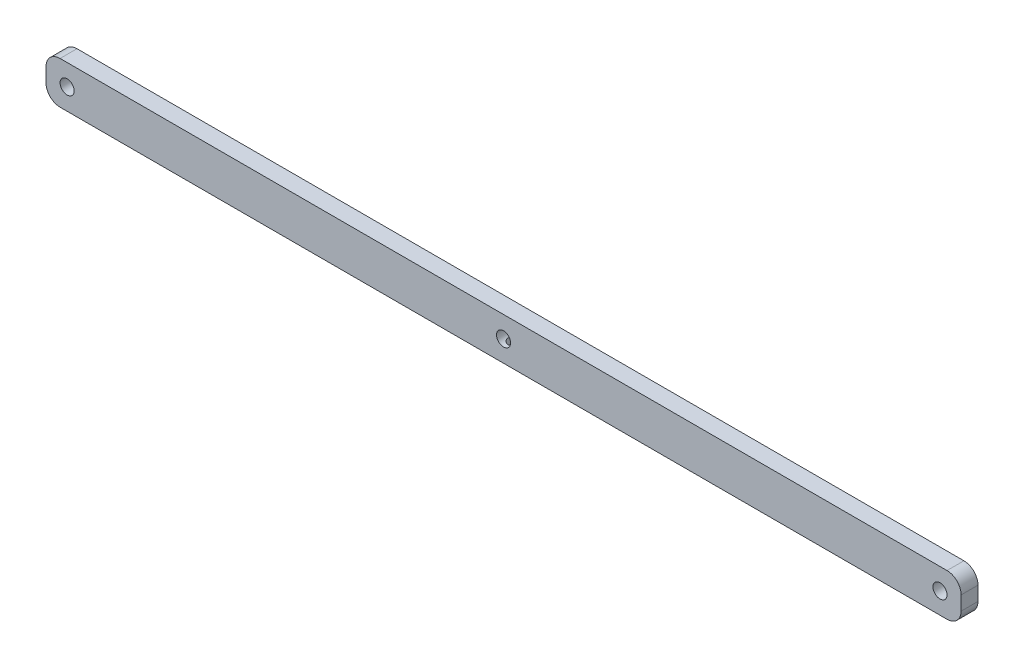
ISO-10303-21;
HEADER;
FILE_DESCRIPTION(('STEP AP214'),'2;1');
FILE_NAME('part.step','',(''),(''),'','','');
FILE_SCHEMA(('AUTOMOTIVE_DESIGN { 1 0 10303 214 1 1 1 1 }'));
ENDSEC;
DATA;
#1=APPLICATION_CONTEXT('core data for automotive mechanical design processes');
#2=APPLICATION_PROTOCOL_DEFINITION('international standard','automotive_design',2000,#1);
#3=PRODUCT_CONTEXT('',#1,'mechanical');
#4=PRODUCT('Part','Part','',(#3));
#5=PRODUCT_RELATED_PRODUCT_CATEGORY('part','',(#4));
#6=PRODUCT_DEFINITION_FORMATION('','',#4);
#7=PRODUCT_DEFINITION_CONTEXT('part definition',#1,'design');
#8=PRODUCT_DEFINITION('design','',#6,#7);
#9=PRODUCT_DEFINITION_SHAPE('','',#8);
#10=(LENGTH_UNIT() NAMED_UNIT(*) SI_UNIT(.MILLI.,.METRE.));
#11=(NAMED_UNIT(*) PLANE_ANGLE_UNIT() SI_UNIT($,.RADIAN.));
#12=(NAMED_UNIT(*) SI_UNIT($,.STERADIAN.) SOLID_ANGLE_UNIT());
#13=UNCERTAINTY_MEASURE_WITH_UNIT(LENGTH_MEASURE(1.E-05),#10,'distance_accuracy_value','');
#14=(GEOMETRIC_REPRESENTATION_CONTEXT(3) GLOBAL_UNCERTAINTY_ASSIGNED_CONTEXT((#13)) GLOBAL_UNIT_ASSIGNED_CONTEXT((#10,
#11,#12)) REPRESENTATION_CONTEXT('',''));
#15=CARTESIAN_POINT('',(0.,0.,0.));
#16=DIRECTION('',(0.,0.,1.));
#17=DIRECTION('',(1.,0.,0.));
#18=AXIS2_PLACEMENT_3D('',#15,#16,#17);
#19=CARTESIAN_POINT('',(0.,0.,3.));
#20=DIRECTION('',(0.,0.,-1.));
#21=DIRECTION('',(-1.,0.,0.));
#22=AXIS2_PLACEMENT_3D('',#19,#20,#21);
#23=PLANE('',#22);
#24=DIRECTION('',(0.,-1.,0.));
#25=VECTOR('',#24,1.);
#26=CARTESIAN_POINT('',(-162.5,-7.5,3.));
#27=LINE('',#26,#25);
#28=CARTESIAN_POINT('',(-162.5,2.5,3.));
#29=VERTEX_POINT('',#28);
#30=CARTESIAN_POINT('',(-162.5,-2.5,3.));
#31=VERTEX_POINT('',#30);
#32=EDGE_CURVE('E169',#29,#31,#27,.T.);
#33=ORIENTED_EDGE('',*,*,#32,.T.);
#34=CARTESIAN_POINT('',(-157.5,-2.5,3.));
#35=DIRECTION('',(0.,0.,-1.));
#36=DIRECTION('',(-1.,0.,0.));
#37=AXIS2_PLACEMENT_3D('',#34,#35,#36);
#38=CIRCLE('',#37,5.);
#39=CARTESIAN_POINT('',(-157.5,-7.5,3.));
#40=VERTEX_POINT('',#39);
#41=EDGE_CURVE('E147',#31,#40,#38,.F.);
#42=ORIENTED_EDGE('',*,*,#41,.T.);
#43=DIRECTION('',(1.,0.,0.));
#44=VECTOR('',#43,1.);
#45=CARTESIAN_POINT('',(162.5,-7.5,3.));
#46=LINE('',#45,#44);
#47=CARTESIAN_POINT('',(157.5,-7.5,3.));
#48=VERTEX_POINT('',#47);
#49=EDGE_CURVE('E117',#40,#48,#46,.T.);
#50=ORIENTED_EDGE('',*,*,#49,.T.);
#51=CARTESIAN_POINT('',(157.5,-2.5,3.));
#52=DIRECTION('',(0.,0.,-1.));
#53=DIRECTION('',(-1.,0.,0.));
#54=AXIS2_PLACEMENT_3D('',#51,#52,#53);
#55=CIRCLE('',#54,5.);
#56=CARTESIAN_POINT('',(162.5,-2.5,3.));
#57=VERTEX_POINT('',#56);
#58=EDGE_CURVE('E53',#48,#57,#55,.F.);
#59=ORIENTED_EDGE('',*,*,#58,.T.);
#60=DIRECTION('',(0.,1.,0.));
#61=VECTOR('',#60,1.);
#62=CARTESIAN_POINT('',(162.5,7.5,3.));
#63=LINE('',#62,#61);
#64=CARTESIAN_POINT('',(162.5,2.5,3.));
#65=VERTEX_POINT('',#64);
#66=EDGE_CURVE('E133',#57,#65,#63,.T.);
#67=ORIENTED_EDGE('',*,*,#66,.T.);
#68=CARTESIAN_POINT('',(157.5,2.5,3.));
#69=DIRECTION('',(0.,0.,-1.));
#70=DIRECTION('',(-1.,0.,0.));
#71=AXIS2_PLACEMENT_3D('',#68,#69,#70);
#72=CIRCLE('',#71,5.);
#73=CARTESIAN_POINT('',(157.5,7.5,3.));
#74=VERTEX_POINT('',#73);
#75=EDGE_CURVE('E143',#65,#74,#72,.F.);
#76=ORIENTED_EDGE('',*,*,#75,.T.);
#77=DIRECTION('',(-1.,0.,0.));
#78=VECTOR('',#77,1.);
#79=CARTESIAN_POINT('',(-162.5,7.5,3.));
#80=LINE('',#79,#78);
#81=CARTESIAN_POINT('',(-157.5,7.5,3.));
#82=VERTEX_POINT('',#81);
#83=EDGE_CURVE('E127',#74,#82,#80,.T.);
#84=ORIENTED_EDGE('',*,*,#83,.T.);
#85=CARTESIAN_POINT('',(-157.5,2.5,3.));
#86=DIRECTION('',(0.,0.,-1.));
#87=DIRECTION('',(-1.,0.,0.));
#88=AXIS2_PLACEMENT_3D('',#85,#86,#87);
#89=CIRCLE('',#88,5.);
#90=EDGE_CURVE('E145',#82,#29,#89,.F.);
#91=ORIENTED_EDGE('',*,*,#90,.T.);
#92=EDGE_LOOP('',(#33,#42,#50,#59,#67,#76,#84,#91));
#93=FACE_BOUND('',#92,.T.);
#94=CARTESIAN_POINT('',(155.,0.,3.));
#95=DIRECTION('',(0.,0.,1.));
#96=DIRECTION('',(1.,0.,0.));
#97=AXIS2_PLACEMENT_3D('',#94,#95,#96);
#98=CIRCLE('',#97,2.5);
#99=CARTESIAN_POINT('',(157.5,0.,3.));
#100=VERTEX_POINT('',#99);
#101=EDGE_CURVE('E178',#100,#100,#98,.T.);
#102=ORIENTED_EDGE('',*,*,#101,.F.);
#103=EDGE_LOOP('',(#102));
#104=FACE_BOUND('',#103,.T.);
#105=CARTESIAN_POINT('',(-155.,0.,3.));
#106=DIRECTION('',(0.,0.,1.));
#107=DIRECTION('',(1.,0.,0.));
#108=AXIS2_PLACEMENT_3D('',#105,#106,#107);
#109=CIRCLE('',#108,2.5);
#110=CARTESIAN_POINT('',(-152.5,0.,3.));
#111=VERTEX_POINT('',#110);
#112=EDGE_CURVE('E183',#111,#111,#109,.T.);
#113=ORIENTED_EDGE('',*,*,#112,.F.);
#114=EDGE_LOOP('',(#113));
#115=FACE_BOUND('',#114,.T.);
#116=CARTESIAN_POINT('',(0.,0.,3.));
#117=DIRECTION('',(0.,0.,1.));
#118=DIRECTION('',(1.,0.,0.));
#119=AXIS2_PLACEMENT_3D('',#116,#117,#118);
#120=CIRCLE('',#119,2.5);
#121=CARTESIAN_POINT('',(2.5,0.,3.));
#122=VERTEX_POINT('',#121);
#123=EDGE_CURVE('E188',#122,#122,#120,.T.);
#124=ORIENTED_EDGE('',*,*,#123,.F.);
#125=EDGE_LOOP('',(#124));
#126=FACE_BOUND('',#125,.T.);
#127=ADVANCED_FACE('F33',(#93,#104,#115,#126),#23,.F.);
#128=CARTESIAN_POINT('',(0.,0.,-3.));
#129=DIRECTION('',(0.,0.,-1.));
#130=DIRECTION('',(-1.,0.,0.));
#131=AXIS2_PLACEMENT_3D('',#128,#129,#130);
#132=PLANE('',#131);
#133=CARTESIAN_POINT('',(-155.,0.,-3.));
#134=DIRECTION('',(0.,0.,1.));
#135=DIRECTION('',(1.,0.,0.));
#136=AXIS2_PLACEMENT_3D('',#133,#134,#135);
#137=CIRCLE('',#136,2.5);
#138=CARTESIAN_POINT('',(-152.5,0.,-3.));
#139=VERTEX_POINT('',#138);
#140=EDGE_CURVE('E185',#139,#139,#137,.T.);
#141=ORIENTED_EDGE('',*,*,#140,.T.);
#142=EDGE_LOOP('',(#141));
#143=FACE_BOUND('',#142,.T.);
#144=DIRECTION('',(1.,0.,0.));
#145=VECTOR('',#144,1.);
#146=CARTESIAN_POINT('',(162.5,-7.5,-3.));
#147=LINE('',#146,#145);
#148=CARTESIAN_POINT('',(-157.5,-7.5,-3.));
#149=VERTEX_POINT('',#148);
#150=CARTESIAN_POINT('',(157.5,-7.5,-3.));
#151=VERTEX_POINT('',#150);
#152=EDGE_CURVE('E115',#149,#151,#147,.T.);
#153=ORIENTED_EDGE('',*,*,#152,.F.);
#154=CARTESIAN_POINT('',(-157.5,-2.5,-3.));
#155=DIRECTION('',(0.,0.,-1.));
#156=DIRECTION('',(-1.,0.,0.));
#157=AXIS2_PLACEMENT_3D('',#154,#155,#156);
#158=CIRCLE('',#157,5.);
#159=CARTESIAN_POINT('',(-162.5,-2.5,-3.));
#160=VERTEX_POINT('',#159);
#161=EDGE_CURVE('E98',#149,#160,#158,.T.);
#162=ORIENTED_EDGE('',*,*,#161,.T.);
#163=DIRECTION('',(0.,-1.,0.));
#164=VECTOR('',#163,1.);
#165=CARTESIAN_POINT('',(-162.5,-7.5,-3.));
#166=LINE('',#165,#164);
#167=CARTESIAN_POINT('',(-162.5,2.5,-3.));
#168=VERTEX_POINT('',#167);
#169=EDGE_CURVE('E125',#168,#160,#166,.T.);
#170=ORIENTED_EDGE('',*,*,#169,.F.);
#171=CARTESIAN_POINT('',(-157.5,2.5,-3.));
#172=DIRECTION('',(0.,0.,-1.));
#173=DIRECTION('',(-1.,0.,0.));
#174=AXIS2_PLACEMENT_3D('',#171,#172,#173);
#175=CIRCLE('',#174,5.);
#176=CARTESIAN_POINT('',(-157.5,7.5,-3.));
#177=VERTEX_POINT('',#176);
#178=EDGE_CURVE('E109',#168,#177,#175,.T.);
#179=ORIENTED_EDGE('',*,*,#178,.T.);
#180=DIRECTION('',(-1.,0.,0.));
#181=VECTOR('',#180,1.);
#182=CARTESIAN_POINT('',(-162.5,7.5,-3.));
#183=LINE('',#182,#181);
#184=CARTESIAN_POINT('',(157.5,7.5,-3.));
#185=VERTEX_POINT('',#184);
#186=EDGE_CURVE('E129',#185,#177,#183,.T.);
#187=ORIENTED_EDGE('',*,*,#186,.F.);
#188=CARTESIAN_POINT('',(157.5,2.5,-3.));
#189=DIRECTION('',(0.,0.,-1.));
#190=DIRECTION('',(-1.,0.,0.));
#191=AXIS2_PLACEMENT_3D('',#188,#189,#190);
#192=CIRCLE('',#191,5.);
#193=CARTESIAN_POINT('',(162.5,2.5,-3.));
#194=VERTEX_POINT('',#193);
#195=EDGE_CURVE('E136',#185,#194,#192,.T.);
#196=ORIENTED_EDGE('',*,*,#195,.T.);
#197=DIRECTION('',(0.,1.,0.));
#198=VECTOR('',#197,1.);
#199=CARTESIAN_POINT('',(162.5,7.5,-3.));
#200=LINE('',#199,#198);
#201=CARTESIAN_POINT('',(162.5,-2.5,-3.));
#202=VERTEX_POINT('',#201);
#203=EDGE_CURVE('E124',#202,#194,#200,.T.);
#204=ORIENTED_EDGE('',*,*,#203,.F.);
#205=CARTESIAN_POINT('',(157.5,-2.5,-3.));
#206=DIRECTION('',(0.,0.,-1.));
#207=DIRECTION('',(-1.,0.,0.));
#208=AXIS2_PLACEMENT_3D('',#205,#206,#207);
#209=CIRCLE('',#208,5.);
#210=EDGE_CURVE('E118',#202,#151,#209,.T.);
#211=ORIENTED_EDGE('',*,*,#210,.T.);
#212=EDGE_LOOP('',(#153,#162,#170,#179,#187,#196,#204,#211));
#213=FACE_BOUND('',#212,.T.);
#214=CARTESIAN_POINT('',(155.,0.,-3.));
#215=DIRECTION('',(0.,0.,1.));
#216=DIRECTION('',(1.,0.,0.));
#217=AXIS2_PLACEMENT_3D('',#214,#215,#216);
#218=CIRCLE('',#217,2.5);
#219=CARTESIAN_POINT('',(157.5,0.,-3.));
#220=VERTEX_POINT('',#219);
#221=EDGE_CURVE('E174',#220,#220,#218,.T.);
#222=ORIENTED_EDGE('',*,*,#221,.T.);
#223=EDGE_LOOP('',(#222));
#224=FACE_BOUND('',#223,.T.);
#225=CARTESIAN_POINT('',(0.,0.,-3.));
#226=DIRECTION('',(0.,0.,1.));
#227=DIRECTION('',(1.,0.,0.));
#228=AXIS2_PLACEMENT_3D('',#225,#226,#227);
#229=CIRCLE('',#228,2.5);
#230=CARTESIAN_POINT('',(2.5,0.,-3.));
#231=VERTEX_POINT('',#230);
#232=EDGE_CURVE('E191',#231,#231,#229,.T.);
#233=ORIENTED_EDGE('',*,*,#232,.T.);
#234=EDGE_LOOP('',(#233));
#235=FACE_BOUND('',#234,.T.);
#236=ADVANCED_FACE('F121',(#143,#213,#224,#235),#132,.T.);
#237=CARTESIAN_POINT('',(-162.5,7.5,3.));
#238=DIRECTION('',(0.,-1.,0.));
#239=DIRECTION('',(0.,0.,-1.));
#240=AXIS2_PLACEMENT_3D('',#237,#238,#239);
#241=PLANE('',#240);
#242=ORIENTED_EDGE('',*,*,#186,.T.);
#243=DIRECTION('',(0.,0.,-1.));
#244=VECTOR('',#243,1.);
#245=CARTESIAN_POINT('',(-157.5,7.5,3.));
#246=LINE('',#245,#244);
#247=EDGE_CURVE('E152',#177,#82,#246,.F.);
#248=ORIENTED_EDGE('',*,*,#247,.T.);
#249=ORIENTED_EDGE('',*,*,#83,.F.);
#250=DIRECTION('',(0.,0.,-1.));
#251=VECTOR('',#250,1.);
#252=CARTESIAN_POINT('',(157.5,7.5,3.));
#253=LINE('',#252,#251);
#254=EDGE_CURVE('E149',#74,#185,#253,.T.);
#255=ORIENTED_EDGE('',*,*,#254,.T.);
#256=EDGE_LOOP('',(#242,#248,#249,#255));
#257=FACE_BOUND('',#256,.T.);
#258=ADVANCED_FACE('F165',(#257),#241,.F.);
#259=CARTESIAN_POINT('',(-162.5,-7.5,3.));
#260=DIRECTION('',(1.,0.,0.));
#261=DIRECTION('',(0.,0.,-1.));
#262=AXIS2_PLACEMENT_3D('',#259,#260,#261);
#263=PLANE('',#262);
#264=ORIENTED_EDGE('',*,*,#169,.T.);
#265=DIRECTION('',(0.,0.,-1.));
#266=VECTOR('',#265,1.);
#267=CARTESIAN_POINT('',(-162.5,-2.5,3.));
#268=LINE('',#267,#266);
#269=EDGE_CURVE('E103',#160,#31,#268,.F.);
#270=ORIENTED_EDGE('',*,*,#269,.T.);
#271=ORIENTED_EDGE('',*,*,#32,.F.);
#272=DIRECTION('',(0.,0.,-1.));
#273=VECTOR('',#272,1.);
#274=CARTESIAN_POINT('',(-162.5,2.5,3.));
#275=LINE('',#274,#273);
#276=EDGE_CURVE('E108',#29,#168,#275,.T.);
#277=ORIENTED_EDGE('',*,*,#276,.T.);
#278=EDGE_LOOP('',(#264,#270,#271,#277));
#279=FACE_BOUND('',#278,.T.);
#280=ADVANCED_FACE('F232',(#279),#263,.F.);
#281=CARTESIAN_POINT('',(162.5,-7.5,3.));
#282=DIRECTION('',(0.,1.,0.));
#283=DIRECTION('',(0.,0.,1.));
#284=AXIS2_PLACEMENT_3D('',#281,#282,#283);
#285=PLANE('',#284);
#286=CARTESIAN_POINT('',(0.,-7.5,0.));
#287=DIRECTION('',(0.,-1.,0.));
#288=DIRECTION('',(0.,0.,-1.));
#289=AXIS2_PLACEMENT_3D('',#286,#287,#288);
#290=CIRCLE('',#289,1.5);
#291=CARTESIAN_POINT('',(0.,-7.5,-1.5));
#292=VERTEX_POINT('',#291);
#293=EDGE_CURVE('E204',#292,#292,#290,.T.);
#294=ORIENTED_EDGE('',*,*,#293,.F.);
#295=EDGE_LOOP('',(#294));
#296=FACE_BOUND('',#295,.T.);
#297=ORIENTED_EDGE('',*,*,#49,.F.);
#298=DIRECTION('',(0.,0.,-1.));
#299=VECTOR('',#298,1.);
#300=CARTESIAN_POINT('',(-157.5,-7.5,3.));
#301=LINE('',#300,#299);
#302=EDGE_CURVE('E102',#40,#149,#301,.T.);
#303=ORIENTED_EDGE('',*,*,#302,.T.);
#304=ORIENTED_EDGE('',*,*,#152,.T.);
#305=DIRECTION('',(0.,0.,-1.));
#306=VECTOR('',#305,1.);
#307=CARTESIAN_POINT('',(157.5,-7.5,3.));
#308=LINE('',#307,#306);
#309=EDGE_CURVE('E119',#151,#48,#308,.F.);
#310=ORIENTED_EDGE('',*,*,#309,.T.);
#311=EDGE_LOOP('',(#297,#303,#304,#310));
#312=FACE_BOUND('',#311,.T.);
#313=ADVANCED_FACE('F114',(#296,#312),#285,.F.);
#314=CARTESIAN_POINT('',(162.5,7.5,3.));
#315=DIRECTION('',(-1.,0.,0.));
#316=DIRECTION('',(0.,0.,1.));
#317=AXIS2_PLACEMENT_3D('',#314,#315,#316);
#318=PLANE('',#317);
#319=ORIENTED_EDGE('',*,*,#203,.T.);
#320=DIRECTION('',(0.,0.,-1.));
#321=VECTOR('',#320,1.);
#322=CARTESIAN_POINT('',(162.5,2.5,3.));
#323=LINE('',#322,#321);
#324=EDGE_CURVE('E11',#194,#65,#323,.F.);
#325=ORIENTED_EDGE('',*,*,#324,.T.);
#326=ORIENTED_EDGE('',*,*,#66,.F.);
#327=DIRECTION('',(0.,0.,-1.));
#328=VECTOR('',#327,1.);
#329=CARTESIAN_POINT('',(162.5,-2.5,3.));
#330=LINE('',#329,#328);
#331=EDGE_CURVE('E41',#57,#202,#330,.T.);
#332=ORIENTED_EDGE('',*,*,#331,.T.);
#333=EDGE_LOOP('',(#319,#325,#326,#332));
#334=FACE_BOUND('',#333,.T.);
#335=ADVANCED_FACE('F155',(#334),#318,.F.);
#336=CARTESIAN_POINT('',(155.,0.,3.));
#337=DIRECTION('',(0.,0.,-1.));
#338=DIRECTION('',(-1.,0.,0.));
#339=AXIS2_PLACEMENT_3D('',#336,#337,#338);
#340=CYLINDRICAL_SURFACE('',#339,2.5);
#341=ORIENTED_EDGE('',*,*,#101,.T.);
#342=EDGE_LOOP('',(#341));
#343=FACE_BOUND('',#342,.T.);
#344=ORIENTED_EDGE('',*,*,#221,.F.);
#345=EDGE_LOOP('',(#344));
#346=FACE_BOUND('',#345,.T.);
#347=ADVANCED_FACE('F225',(#343,#346),#340,.F.);
#348=CARTESIAN_POINT('',(-155.,0.,3.));
#349=DIRECTION('',(0.,0.,-1.));
#350=DIRECTION('',(-1.,0.,0.));
#351=AXIS2_PLACEMENT_3D('',#348,#349,#350);
#352=CYLINDRICAL_SURFACE('',#351,2.5);
#353=ORIENTED_EDGE('',*,*,#112,.T.);
#354=EDGE_LOOP('',(#353));
#355=FACE_BOUND('',#354,.T.);
#356=ORIENTED_EDGE('',*,*,#140,.F.);
#357=EDGE_LOOP('',(#356));
#358=FACE_BOUND('',#357,.T.);
#359=ADVANCED_FACE('F271',(#355,#358),#352,.F.);
#360=CARTESIAN_POINT('',(0.,0.,3.));
#361=DIRECTION('',(0.,0.,-1.));
#362=DIRECTION('',(-1.,0.,0.));
#363=AXIS2_PLACEMENT_3D('',#360,#361,#362);
#364=CYLINDRICAL_SURFACE('',#363,2.5);
#365=CARTESIAN_POINT('',(0.,-2.5,-1.5));
#366=CARTESIAN_POINT('',(-0.0767298334620157,-2.49999625789732,-1.49999590899012));
#367=CARTESIAN_POINT('',(-0.153582320644178,-2.4964290461501,-1.49407132907373));
#368=CARTESIAN_POINT('',(-0.304975509530678,-2.48249903608567,-1.47067568048467));
#369=CARTESIAN_POINT('',(-0.379510034596046,-2.47211948032718,-1.45317613814577));
#370=CARTESIAN_POINT('',(-0.523751827790836,-2.44561558054488,-1.40761363883314));
#371=CARTESIAN_POINT('',(-0.593481028226564,-2.42951973272944,-1.37960304183684));
#372=CARTESIAN_POINT('',(-0.727030318214657,-2.39295367626407,-1.31413966685897));
#373=CARTESIAN_POINT('',(-0.790851869416381,-2.37248455380255,-1.27668923303125));
#374=CARTESIAN_POINT('',(-0.916299278999313,-2.32705360719088,-1.19022517329141));
#375=CARTESIAN_POINT('',(-0.977384020081413,-2.30186792195985,-1.14054630464861));
#376=CARTESIAN_POINT('',(-1.09088270411891,-2.25030439279634,-1.03253279617173));
#377=CARTESIAN_POINT('',(-1.14328534948112,-2.22392505153571,-0.974187062812681));
#378=CARTESIAN_POINT('',(-1.24444996762974,-2.1691106699591,-0.842076489503266));
#379=CARTESIAN_POINT('',(-1.29197766378809,-2.14082017703649,-0.76729822901871));
#380=CARTESIAN_POINT('',(-1.37361437764896,-2.08938301412124,-0.609153426756885));
#381=CARTESIAN_POINT('',(-1.40774517335159,-2.06622802273938,-0.525801103752431));
#382=CARTESIAN_POINT('',(-1.45440601714221,-2.0335462966093,-0.373403549346758));
#383=CARTESIAN_POINT('',(-1.47016197246826,-2.02207883137591,-0.305764001389682));
#384=CARTESIAN_POINT('',(-1.49216172340475,-2.00590308295503,-0.168196284169635));
#385=CARTESIAN_POINT('',(-1.49841734556835,-2.0011863964376,-0.0982710712455055));
#386=CARTESIAN_POINT('',(-1.50105508796008,-1.99920922463856,0.0420114942173357));
#387=CARTESIAN_POINT('',(-1.49741783408418,-2.00196337012718,0.112369425093197));
#388=CARTESIAN_POINT('',(-1.48046060478827,-2.01453261443741,0.251278775427587));
#389=CARTESIAN_POINT('',(-1.46713334620103,-2.02435302432226,0.319828795847444));
#390=CARTESIAN_POINT('',(-1.43173921881792,-2.04953186944258,0.452530242128105));
#391=CARTESIAN_POINT('',(-1.40978748666087,-2.06481711652537,0.516727053924482));
#392=CARTESIAN_POINT('',(-1.35795061770836,-2.09927051350828,0.640694990928123));
#393=CARTESIAN_POINT('',(-1.32806257259704,-2.11844008623465,0.700464483423925));
#394=CARTESIAN_POINT('',(-1.25517983184582,-2.16255327268985,0.824984097122802));
#395=CARTESIAN_POINT('',(-1.21080724397723,-2.18792043372992,0.888778092954926));
#396=CARTESIAN_POINT('',(-1.11291092784003,-2.23930599764381,1.00867648366701));
#397=CARTESIAN_POINT('',(-1.05937845100578,-2.26532500262149,1.0647734339765));
#398=CARTESIAN_POINT('',(-0.935811834382963,-2.31935504958317,1.17561298182176));
#399=CARTESIAN_POINT('',(-0.864517682704954,-2.34713836268532,1.22907730601599));
#400=CARTESIAN_POINT('',(-0.712276050458997,-2.3977242843398,1.32312204719791));
#401=CARTESIAN_POINT('',(-0.631333763943561,-2.42052955425515,1.36370935378995));
#402=CARTESIAN_POINT('',(-0.467197585268203,-2.45730392066151,1.4279321827959));
#403=CARTESIAN_POINT('',(-0.384467624173577,-2.47173957439703,1.45247535571591));
#404=CARTESIAN_POINT('',(-0.215047895144637,-2.4921884281355,1.48701119740538));
#405=CARTESIAN_POINT('',(-0.128363005661317,-2.49821172952737,1.49702131775357));
#406=CARTESIAN_POINT('',(0.0337146143773977,-2.5009057037461,1.50150784767831));
#407=CARTESIAN_POINT('',(0.109042473418719,-2.49873521714286,1.49790885508517));
#408=CARTESIAN_POINT('',(0.257829401986061,-2.48778712087048,1.47957414692807));
#409=CARTESIAN_POINT('',(0.331288509376106,-2.47900964518037,1.46483865719418));
#410=CARTESIAN_POINT('',(0.472574932157613,-2.4559479244219,1.42545656718753));
#411=CARTESIAN_POINT('',(0.540495750928483,-2.44180275662555,1.40105965092653));
#412=CARTESIAN_POINT('',(0.671265749087262,-2.40913880862844,1.34332262363473));
#413=CARTESIAN_POINT('',(0.734113924963908,-2.39061916586511,1.30998074865333));
#414=CARTESIAN_POINT('',(0.860006262823863,-2.3484549623736,1.23144302079129));
#415=CARTESIAN_POINT('',(0.922394150456836,-2.3244780273988,1.1853761709216));
#416=CARTESIAN_POINT('',(1.03902603131014,-2.27474265574731,1.08460860651138));
#417=CARTESIAN_POINT('',(1.09326040273738,-2.2489821658636,1.02989784514746));
#418=CARTESIAN_POINT('',(1.19931996735579,-2.19445423909891,0.905089609962844));
#419=CARTESIAN_POINT('',(1.24991019630915,-2.16573241746291,0.833916114534493));
#420=CARTESIAN_POINT('',(1.33845238915667,-2.1121618206671,0.682783975431793));
#421=CARTESIAN_POINT('',(1.37641766769781,-2.0873089799769,0.602834706107212));
#422=CARTESIAN_POINT('',(1.43142578795776,-2.04984909240519,0.453756977693308));
#423=CARTESIAN_POINT('',(1.4512162533619,-2.03575659328729,0.386019687641409));
#424=CARTESIAN_POINT('',(1.48113663905971,-2.01409605743544,0.247467921919894));
#425=CARTESIAN_POINT('',(1.4912799529763,-2.00651897642721,0.176657855672171));
#426=CARTESIAN_POINT('',(1.50134130416631,-1.99900446616268,0.0336230524029664));
#427=CARTESIAN_POINT('',(1.50122089107869,-1.99909576445937,-0.0386059906870445));
#428=CARTESIAN_POINT('',(1.49066472959327,-2.0069771789285,-0.18189443560946));
#429=CARTESIAN_POINT('',(1.48022337215758,-2.0147714813882,-0.252953180080597));
#430=CARTESIAN_POINT('',(1.45040174148912,-2.0363318524298,-0.388488417572187));
#431=CARTESIAN_POINT('',(1.43147636845351,-2.04979211805581,-0.453117094306872));
#432=CARTESIAN_POINT('',(1.38563242076993,-2.08105501960151,-0.578337254474217));
#433=CARTESIAN_POINT('',(1.35871083588479,-2.09885929040482,-0.638927206960553));
#434=CARTESIAN_POINT('',(1.29289245555732,-2.14012990550917,-0.764319857220779));
#435=CARTESIAN_POINT('',(1.25279167675753,-2.1640458758264,-0.828341103854307));
#436=CARTESIAN_POINT('',(1.16375698389084,-2.21320127030768,-0.949380072617289));
#437=CARTESIAN_POINT('',(1.11481579607798,-2.23844177205021,-1.00639196215256));
#438=CARTESIAN_POINT('',(1.00009777425734,-2.29225690291476,-1.12135094913167));
#439=CARTESIAN_POINT('',(0.932876819313901,-2.32070308663658,-1.17793107489619));
#440=CARTESIAN_POINT('',(0.788462434445586,-2.37365428872367,-1.2790978558633));
#441=CARTESIAN_POINT('',(0.711265444501537,-2.39815789310936,-1.32368021198479));
#442=CARTESIAN_POINT('',(0.551125230801451,-2.43985578654394,-1.39778580757373));
#443=CARTESIAN_POINT('',(0.468430086957212,-2.45725077479787,-1.42772806492683));
#444=CARTESIAN_POINT('',(0.297973306118806,-2.48366273001246,-1.47272469521097));
#445=CARTESIAN_POINT('',(0.21023209964861,-2.49271125871485,-1.48783516785699));
#446=CARTESIAN_POINT('',(0.101558096917535,-2.49802001168186,-1.49669745470866));
#447=CARTESIAN_POINT('',(0.0812762590282768,-2.49876114656362,-1.49793441730609));
#448=CARTESIAN_POINT('',(0.0406658206871123,-2.49975164517367,-1.49958624637086));
#449=CARTESIAN_POINT('',(0.0203372186375694,-2.50000099184316,-1.5000010843209));
#450=CARTESIAN_POINT('',(0.,-2.5,-1.5));
#451=B_SPLINE_CURVE_WITH_KNOTS('',3,(#365,#366,#367,#368,#369,#370,#371,#372,#373,#374,#375,
#376,#377,#378,#379,#380,#381,#382,#383,#384,#385,#386,#387,#388,#389,#390,#391,#392,#393,#394,
#395,#396,#397,#398,#399,#400,#401,#402,#403,#404,#405,#406,#407,#408,#409,#410,#411,#412,#413,
#414,#415,#416,#417,#418,#419,#420,#421,#422,#423,#424,#425,#426,#427,#428,#429,#430,#431,#432,
#433,#434,#435,#436,#437,#438,#439,#440,#441,#442,#443,#444,#445,#446,#447,#448,#449,#450),
.UNSPECIFIED.,.T.,.F.,(4,2,2,2,2,2,2,2,2,2,2,2,2,2,2,2,2,2,2,2,2,2,2,2,2,2,2,2,2,2,2,2,2,2,2,2,
2,2,2,2,2,2,4),(0.,0.230102237548649,0.460772627520011,0.690308884600011,0.919788197992273,
1.16681590732472,1.414162579348,1.69183813189807,1.96906040692091,2.17933829855633,
2.38935420916577,2.59978170870725,2.81036753273872,3.01823267593206,3.22617409809868,
3.47046995225162,3.71500044803674,3.9936095788469,4.27206939275323,4.53296790696559,
4.79355286918235,5.01875602722425,5.24395461863454,5.46367785689771,5.68344445659024,
5.92601365818361,6.16886690081835,6.44336762428008,6.71757792616455,6.93257787314691,
7.14727888733317,7.36278425777431,7.57840681155723,7.7836409833114,7.98895251523033,
8.22578610052284,8.46281544370206,8.73854311775517,9.01436946031983,9.28175654462675,
9.54812832184446,9.60911473335175,9.67010326027638),.UNSPECIFIED.);
#452=CARTESIAN_POINT('',(0.,-2.5,-1.5));
#453=VERTEX_POINT('',#452);
#454=EDGE_CURVE('E194',#453,#453,#451,.T.);
#455=ORIENTED_EDGE('',*,*,#454,.F.);
#456=EDGE_LOOP('',(#455));
#457=FACE_BOUND('',#456,.T.);
#458=ORIENTED_EDGE('',*,*,#123,.T.);
#459=EDGE_LOOP('',(#458));
#460=FACE_BOUND('',#459,.T.);
#461=ORIENTED_EDGE('',*,*,#232,.F.);
#462=EDGE_LOOP('',(#461));
#463=FACE_BOUND('',#462,.T.);
#464=ADVANCED_FACE('F242',(#457,#460,#463),#364,.F.);
#465=CARTESIAN_POINT('',(-157.5,-2.5,3.));
#466=DIRECTION('',(0.,0.,-1.));
#467=DIRECTION('',(-1.,0.,0.));
#468=AXIS2_PLACEMENT_3D('',#465,#466,#467);
#469=CYLINDRICAL_SURFACE('',#468,5.);
#470=ORIENTED_EDGE('',*,*,#41,.F.);
#471=ORIENTED_EDGE('',*,*,#269,.F.);
#472=ORIENTED_EDGE('',*,*,#161,.F.);
#473=ORIENTED_EDGE('',*,*,#302,.F.);
#474=EDGE_LOOP('',(#470,#471,#472,#473));
#475=FACE_BOUND('',#474,.T.);
#476=ADVANCED_FACE('F101',(#475),#469,.T.);
#477=CARTESIAN_POINT('',(-157.5,2.5,3.));
#478=DIRECTION('',(0.,0.,-1.));
#479=DIRECTION('',(-1.,0.,0.));
#480=AXIS2_PLACEMENT_3D('',#477,#478,#479);
#481=CYLINDRICAL_SURFACE('',#480,5.);
#482=ORIENTED_EDGE('',*,*,#90,.F.);
#483=ORIENTED_EDGE('',*,*,#247,.F.);
#484=ORIENTED_EDGE('',*,*,#178,.F.);
#485=ORIENTED_EDGE('',*,*,#276,.F.);
#486=EDGE_LOOP('',(#482,#483,#484,#485));
#487=FACE_BOUND('',#486,.T.);
#488=ADVANCED_FACE('F241',(#487),#481,.T.);
#489=CARTESIAN_POINT('',(157.5,2.5,3.));
#490=DIRECTION('',(0.,0.,-1.));
#491=DIRECTION('',(-1.,0.,0.));
#492=AXIS2_PLACEMENT_3D('',#489,#490,#491);
#493=CYLINDRICAL_SURFACE('',#492,5.);
#494=ORIENTED_EDGE('',*,*,#75,.F.);
#495=ORIENTED_EDGE('',*,*,#324,.F.);
#496=ORIENTED_EDGE('',*,*,#195,.F.);
#497=ORIENTED_EDGE('',*,*,#254,.F.);
#498=EDGE_LOOP('',(#494,#495,#496,#497));
#499=FACE_BOUND('',#498,.T.);
#500=ADVANCED_FACE('F162',(#499),#493,.T.);
#501=CARTESIAN_POINT('',(157.5,-2.5,3.));
#502=DIRECTION('',(0.,0.,-1.));
#503=DIRECTION('',(-1.,0.,0.));
#504=AXIS2_PLACEMENT_3D('',#501,#502,#503);
#505=CYLINDRICAL_SURFACE('',#504,5.);
#506=ORIENTED_EDGE('',*,*,#58,.F.);
#507=ORIENTED_EDGE('',*,*,#309,.F.);
#508=ORIENTED_EDGE('',*,*,#210,.F.);
#509=ORIENTED_EDGE('',*,*,#331,.F.);
#510=EDGE_LOOP('',(#506,#507,#508,#509));
#511=FACE_BOUND('',#510,.T.);
#512=ADVANCED_FACE('F35',(#511),#505,.T.);
#513=CARTESIAN_POINT('',(0.,-7.5,0.));
#514=DIRECTION('',(0.,-1.,0.));
#515=DIRECTION('',(0.,0.,-1.));
#516=AXIS2_PLACEMENT_3D('',#513,#514,#515);
#517=CYLINDRICAL_SURFACE('',#516,1.5);
#518=ORIENTED_EDGE('',*,*,#293,.T.);
#519=EDGE_LOOP('',(#518));
#520=FACE_BOUND('',#519,.T.);
#521=ORIENTED_EDGE('',*,*,#454,.T.);
#522=EDGE_LOOP('',(#521));
#523=FACE_BOUND('',#522,.T.);
#524=ADVANCED_FACE('F207',(#520,#523),#517,.F.);
#525=CLOSED_SHELL('',(#127,#236,#258,#280,#313,#335,#347,#359,#464,#476,#488,#500,#512,#524));
#526=MANIFOLD_SOLID_BREP('B2',#525);
#527=ADVANCED_BREP_SHAPE_REPRESENTATION('',(#18,#526),#14);
#528=SHAPE_DEFINITION_REPRESENTATION(#9,#527);
ENDSEC;
END-ISO-10303-21;
